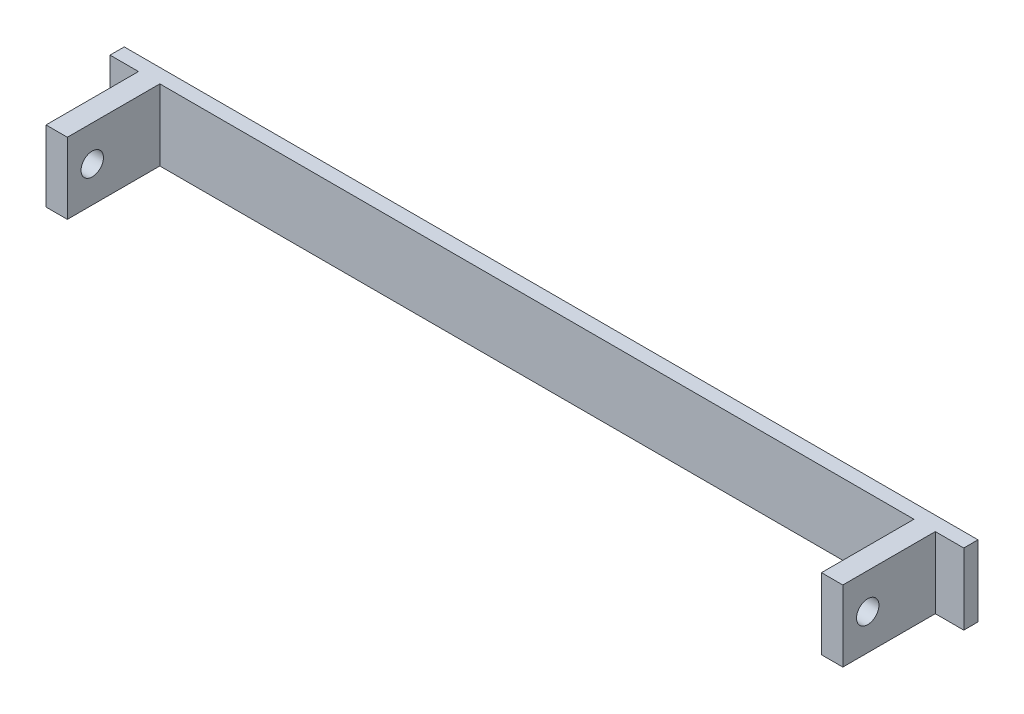
ISO-10303-21;
HEADER;
FILE_DESCRIPTION(('STEP AP214'),'2;1');
FILE_NAME('part.step','',(''),(''),'','','');
FILE_SCHEMA(('AUTOMOTIVE_DESIGN { 1 0 10303 214 1 1 1 1 }'));
ENDSEC;
DATA;
#1=APPLICATION_CONTEXT('core data for automotive mechanical design processes');
#2=APPLICATION_PROTOCOL_DEFINITION('international standard','automotive_design',2000,#1);
#3=PRODUCT_CONTEXT('',#1,'mechanical');
#4=PRODUCT('Part','Part','',(#3));
#5=PRODUCT_RELATED_PRODUCT_CATEGORY('part','',(#4));
#6=PRODUCT_DEFINITION_FORMATION('','',#4);
#7=PRODUCT_DEFINITION_CONTEXT('part definition',#1,'design');
#8=PRODUCT_DEFINITION('design','',#6,#7);
#9=PRODUCT_DEFINITION_SHAPE('','',#8);
#10=(LENGTH_UNIT() NAMED_UNIT(*) SI_UNIT(.MILLI.,.METRE.));
#11=(NAMED_UNIT(*) PLANE_ANGLE_UNIT() SI_UNIT($,.RADIAN.));
#12=(NAMED_UNIT(*) SI_UNIT($,.STERADIAN.) SOLID_ANGLE_UNIT());
#13=UNCERTAINTY_MEASURE_WITH_UNIT(LENGTH_MEASURE(1.E-05),#10,'distance_accuracy_value','');
#14=(GEOMETRIC_REPRESENTATION_CONTEXT(3) GLOBAL_UNCERTAINTY_ASSIGNED_CONTEXT((#13)) GLOBAL_UNIT_ASSIGNED_CONTEXT((#10,
#11,#12)) REPRESENTATION_CONTEXT('',''));
#15=CARTESIAN_POINT('',(0.,0.,0.));
#16=DIRECTION('',(0.,0.,1.));
#17=DIRECTION('',(1.,0.,0.));
#18=AXIS2_PLACEMENT_3D('',#15,#16,#17);
#19=CARTESIAN_POINT('',(0.,0.,2.));
#20=DIRECTION('',(0.,0.,-1.));
#21=DIRECTION('',(-1.,0.,0.));
#22=AXIS2_PLACEMENT_3D('',#19,#20,#21);
#23=PLANE('',#22);
#24=DIRECTION('',(0.,-1.,0.));
#25=VECTOR('',#24,1.);
#26=CARTESIAN_POINT('',(53.,5.,2.));
#27=LINE('',#26,#25);
#28=CARTESIAN_POINT('',(53.,5.,2.));
#29=VERTEX_POINT('',#28);
#30=CARTESIAN_POINT('',(53.,-5.,2.));
#31=VERTEX_POINT('',#30);
#32=EDGE_CURVE('E48',#29,#31,#27,.T.);
#33=ORIENTED_EDGE('',*,*,#32,.F.);
#34=DIRECTION('',(-1.,0.,0.));
#35=VECTOR('',#34,1.);
#36=CARTESIAN_POINT('',(-60.,5.,2.));
#37=LINE('',#36,#35);
#38=CARTESIAN_POINT('',(-53.,5.,2.));
#39=VERTEX_POINT('',#38);
#40=EDGE_CURVE('E185',#29,#39,#37,.T.);
#41=ORIENTED_EDGE('',*,*,#40,.T.);
#42=DIRECTION('',(0.,1.,0.));
#43=VECTOR('',#42,1.);
#44=CARTESIAN_POINT('',(-53.,5.,2.));
#45=LINE('',#44,#43);
#46=CARTESIAN_POINT('',(-53.,-5.,2.));
#47=VERTEX_POINT('',#46);
#48=EDGE_CURVE('E149',#47,#39,#45,.T.);
#49=ORIENTED_EDGE('',*,*,#48,.F.);
#50=DIRECTION('',(1.,0.,0.));
#51=VECTOR('',#50,1.);
#52=CARTESIAN_POINT('',(-60.,-5.,2.));
#53=LINE('',#52,#51);
#54=EDGE_CURVE('E191',#47,#31,#53,.T.);
#55=ORIENTED_EDGE('',*,*,#54,.T.);
#56=EDGE_LOOP('',(#33,#41,#49,#55));
#57=FACE_BOUND('',#56,.T.);
#58=ADVANCED_FACE('F33',(#57),#23,.F.);
#59=DIRECTION('',(0.,1.,0.));
#60=VECTOR('',#59,1.);
#61=CARTESIAN_POINT('',(56.,5.,2.));
#62=LINE('',#61,#60);
#63=CARTESIAN_POINT('',(56.,-5.,2.));
#64=VERTEX_POINT('',#63);
#65=CARTESIAN_POINT('',(56.,5.,2.));
#66=VERTEX_POINT('',#65);
#67=EDGE_CURVE('E143',#64,#66,#62,.T.);
#68=ORIENTED_EDGE('',*,*,#67,.F.);
#69=CARTESIAN_POINT('',(60.,-5.,2.));
#70=VERTEX_POINT('',#69);
#71=EDGE_CURVE('E187',#64,#70,#53,.T.);
#72=ORIENTED_EDGE('',*,*,#71,.T.);
#73=DIRECTION('',(0.,1.,0.));
#74=VECTOR('',#73,1.);
#75=CARTESIAN_POINT('',(60.,-5.,2.));
#76=LINE('',#75,#74);
#77=CARTESIAN_POINT('',(60.,5.,2.));
#78=VERTEX_POINT('',#77);
#79=EDGE_CURVE('E179',#70,#78,#76,.T.);
#80=ORIENTED_EDGE('',*,*,#79,.T.);
#81=EDGE_CURVE('E56',#78,#66,#37,.T.);
#82=ORIENTED_EDGE('',*,*,#81,.T.);
#83=EDGE_LOOP('',(#68,#72,#80,#82));
#84=FACE_BOUND('',#83,.T.);
#85=ADVANCED_FACE('F221',(#84),#23,.F.);
#86=DIRECTION('',(0.,-1.,0.));
#87=VECTOR('',#86,1.);
#88=CARTESIAN_POINT('',(-56.,5.,2.));
#89=LINE('',#88,#87);
#90=CARTESIAN_POINT('',(-56.,5.,2.));
#91=VERTEX_POINT('',#90);
#92=CARTESIAN_POINT('',(-56.,-5.,2.));
#93=VERTEX_POINT('',#92);
#94=EDGE_CURVE('E146',#91,#93,#89,.T.);
#95=ORIENTED_EDGE('',*,*,#94,.F.);
#96=CARTESIAN_POINT('',(-60.,5.,2.));
#97=VERTEX_POINT('',#96);
#98=EDGE_CURVE('E181',#91,#97,#37,.T.);
#99=ORIENTED_EDGE('',*,*,#98,.T.);
#100=DIRECTION('',(0.,-1.,0.));
#101=VECTOR('',#100,1.);
#102=CARTESIAN_POINT('',(-60.,-5.,2.));
#103=LINE('',#102,#101);
#104=CARTESIAN_POINT('',(-60.,-5.,2.));
#105=VERTEX_POINT('',#104);
#106=EDGE_CURVE('E184',#97,#105,#103,.T.);
#107=ORIENTED_EDGE('',*,*,#106,.T.);
#108=EDGE_CURVE('E188',#105,#93,#53,.T.);
#109=ORIENTED_EDGE('',*,*,#108,.T.);
#110=EDGE_LOOP('',(#95,#99,#107,#109));
#111=FACE_BOUND('',#110,.T.);
#112=ADVANCED_FACE('F236',(#111),#23,.F.);
#113=CARTESIAN_POINT('',(60.,-5.,2.));
#114=DIRECTION('',(-1.,0.,0.));
#115=DIRECTION('',(0.,0.,1.));
#116=AXIS2_PLACEMENT_3D('',#113,#114,#115);
#117=PLANE('',#116);
#118=DIRECTION('',(0.,1.,0.));
#119=VECTOR('',#118,1.);
#120=CARTESIAN_POINT('',(60.,-5.,0.));
#121=LINE('',#120,#119);
#122=CARTESIAN_POINT('',(60.,-5.,0.));
#123=VERTEX_POINT('',#122);
#124=CARTESIAN_POINT('',(60.,5.,0.));
#125=VERTEX_POINT('',#124);
#126=EDGE_CURVE('E178',#123,#125,#121,.T.);
#127=ORIENTED_EDGE('',*,*,#126,.T.);
#128=DIRECTION('',(0.,0.,-1.));
#129=VECTOR('',#128,1.);
#130=CARTESIAN_POINT('',(60.,5.,2.));
#131=LINE('',#130,#129);
#132=EDGE_CURVE('E11',#78,#125,#131,.T.);
#133=ORIENTED_EDGE('',*,*,#132,.F.);
#134=ORIENTED_EDGE('',*,*,#79,.F.);
#135=DIRECTION('',(0.,0.,-1.));
#136=VECTOR('',#135,1.);
#137=CARTESIAN_POINT('',(60.,-5.,2.));
#138=LINE('',#137,#136);
#139=EDGE_CURVE('E190',#70,#123,#138,.T.);
#140=ORIENTED_EDGE('',*,*,#139,.T.);
#141=EDGE_LOOP('',(#127,#133,#134,#140));
#142=FACE_BOUND('',#141,.T.);
#143=ADVANCED_FACE('F35',(#142),#117,.F.);
#144=CARTESIAN_POINT('',(-60.,5.,2.));
#145=DIRECTION('',(0.,-1.,0.));
#146=DIRECTION('',(0.,0.,-1.));
#147=AXIS2_PLACEMENT_3D('',#144,#145,#146);
#148=PLANE('',#147);
#149=DIRECTION('',(-1.,0.,0.));
#150=VECTOR('',#149,1.);
#151=CARTESIAN_POINT('',(-60.,5.,0.));
#152=LINE('',#151,#150);
#153=CARTESIAN_POINT('',(-60.,5.,0.));
#154=VERTEX_POINT('',#153);
#155=EDGE_CURVE('E194',#125,#154,#152,.T.);
#156=ORIENTED_EDGE('',*,*,#155,.T.);
#157=DIRECTION('',(0.,0.,-1.));
#158=VECTOR('',#157,1.);
#159=CARTESIAN_POINT('',(-60.,5.,2.));
#160=LINE('',#159,#158);
#161=EDGE_CURVE('E41',#97,#154,#160,.T.);
#162=ORIENTED_EDGE('',*,*,#161,.F.);
#163=ORIENTED_EDGE('',*,*,#98,.F.);
#164=DIRECTION('',(0.,0.,-1.));
#165=VECTOR('',#164,1.);
#166=CARTESIAN_POINT('',(-56.,5.,15.));
#167=LINE('',#166,#165);
#168=CARTESIAN_POINT('',(-56.,5.,15.));
#169=VERTEX_POINT('',#168);
#170=EDGE_CURVE('E163',#169,#91,#167,.T.);
#171=ORIENTED_EDGE('',*,*,#170,.F.);
#172=DIRECTION('',(-1.,0.,0.));
#173=VECTOR('',#172,1.);
#174=CARTESIAN_POINT('',(-56.,5.,15.));
#175=LINE('',#174,#173);
#176=CARTESIAN_POINT('',(-53.,5.,15.));
#177=VERTEX_POINT('',#176);
#178=EDGE_CURVE('E162',#177,#169,#175,.T.);
#179=ORIENTED_EDGE('',*,*,#178,.F.);
#180=DIRECTION('',(0.,0.,-1.));
#181=VECTOR('',#180,1.);
#182=CARTESIAN_POINT('',(-53.,5.,15.));
#183=LINE('',#182,#181);
#184=EDGE_CURVE('E169',#177,#39,#183,.T.);
#185=ORIENTED_EDGE('',*,*,#184,.T.);
#186=ORIENTED_EDGE('',*,*,#40,.F.);
#187=DIRECTION('',(0.,0.,-1.));
#188=VECTOR('',#187,1.);
#189=CARTESIAN_POINT('',(53.,5.,15.));
#190=LINE('',#189,#188);
#191=CARTESIAN_POINT('',(53.,5.,15.));
#192=VERTEX_POINT('',#191);
#193=EDGE_CURVE('E238',#192,#29,#190,.T.);
#194=ORIENTED_EDGE('',*,*,#193,.F.);
#195=DIRECTION('',(-1.,0.,0.));
#196=VECTOR('',#195,1.);
#197=CARTESIAN_POINT('',(53.,5.,15.));
#198=LINE('',#197,#196);
#199=CARTESIAN_POINT('',(56.,5.,15.));
#200=VERTEX_POINT('',#199);
#201=EDGE_CURVE('E139',#200,#192,#198,.T.);
#202=ORIENTED_EDGE('',*,*,#201,.F.);
#203=DIRECTION('',(0.,0.,-1.));
#204=VECTOR('',#203,1.);
#205=CARTESIAN_POINT('',(56.,5.,15.));
#206=LINE('',#205,#204);
#207=EDGE_CURVE('E151',#200,#66,#206,.T.);
#208=ORIENTED_EDGE('',*,*,#207,.T.);
#209=ORIENTED_EDGE('',*,*,#81,.F.);
#210=ORIENTED_EDGE('',*,*,#132,.T.);
#211=EDGE_LOOP('',(#156,#162,#163,#171,#179,#185,#186,#194,#202,#208,#209,#210));
#212=FACE_BOUND('',#211,.T.);
#213=ADVANCED_FACE('F237',(#212),#148,.F.);
#214=CARTESIAN_POINT('',(-60.,-5.,2.));
#215=DIRECTION('',(1.,0.,0.));
#216=DIRECTION('',(0.,0.,-1.));
#217=AXIS2_PLACEMENT_3D('',#214,#215,#216);
#218=PLANE('',#217);
#219=DIRECTION('',(0.,-1.,0.));
#220=VECTOR('',#219,1.);
#221=CARTESIAN_POINT('',(-60.,-5.,0.));
#222=LINE('',#221,#220);
#223=CARTESIAN_POINT('',(-60.,-5.,0.));
#224=VERTEX_POINT('',#223);
#225=EDGE_CURVE('E196',#154,#224,#222,.T.);
#226=ORIENTED_EDGE('',*,*,#225,.T.);
#227=DIRECTION('',(0.,0.,-1.));
#228=VECTOR('',#227,1.);
#229=CARTESIAN_POINT('',(-60.,-5.,2.));
#230=LINE('',#229,#228);
#231=EDGE_CURVE('E201',#105,#224,#230,.T.);
#232=ORIENTED_EDGE('',*,*,#231,.F.);
#233=ORIENTED_EDGE('',*,*,#106,.F.);
#234=ORIENTED_EDGE('',*,*,#161,.T.);
#235=EDGE_LOOP('',(#226,#232,#233,#234));
#236=FACE_BOUND('',#235,.T.);
#237=ADVANCED_FACE('F208',(#236),#218,.F.);
#238=CARTESIAN_POINT('',(-60.,-5.,2.));
#239=DIRECTION('',(0.,1.,0.));
#240=DIRECTION('',(0.,0.,1.));
#241=AXIS2_PLACEMENT_3D('',#238,#239,#240);
#242=PLANE('',#241);
#243=DIRECTION('',(1.,0.,0.));
#244=VECTOR('',#243,1.);
#245=CARTESIAN_POINT('',(-60.,-5.,0.));
#246=LINE('',#245,#244);
#247=EDGE_CURVE('E182',#224,#123,#246,.T.);
#248=ORIENTED_EDGE('',*,*,#247,.T.);
#249=ORIENTED_EDGE('',*,*,#139,.F.);
#250=ORIENTED_EDGE('',*,*,#71,.F.);
#251=DIRECTION('',(0.,0.,-1.));
#252=VECTOR('',#251,1.);
#253=CARTESIAN_POINT('',(56.,-5.,15.));
#254=LINE('',#253,#252);
#255=CARTESIAN_POINT('',(56.,-5.,15.));
#256=VERTEX_POINT('',#255);
#257=EDGE_CURVE('E130',#256,#64,#254,.T.);
#258=ORIENTED_EDGE('',*,*,#257,.F.);
#259=DIRECTION('',(1.,0.,0.));
#260=VECTOR('',#259,1.);
#261=CARTESIAN_POINT('',(53.,-5.,15.));
#262=LINE('',#261,#260);
#263=CARTESIAN_POINT('',(53.,-5.,15.));
#264=VERTEX_POINT('',#263);
#265=EDGE_CURVE('E123',#264,#256,#262,.T.);
#266=ORIENTED_EDGE('',*,*,#265,.F.);
#267=DIRECTION('',(0.,0.,-1.));
#268=VECTOR('',#267,1.);
#269=CARTESIAN_POINT('',(53.,-5.,15.));
#270=LINE('',#269,#268);
#271=EDGE_CURVE('E128',#264,#31,#270,.T.);
#272=ORIENTED_EDGE('',*,*,#271,.T.);
#273=ORIENTED_EDGE('',*,*,#54,.F.);
#274=DIRECTION('',(0.,0.,-1.));
#275=VECTOR('',#274,1.);
#276=CARTESIAN_POINT('',(-53.,-5.,15.));
#277=LINE('',#276,#275);
#278=CARTESIAN_POINT('',(-53.,-5.,15.));
#279=VERTEX_POINT('',#278);
#280=EDGE_CURVE('E172',#279,#47,#277,.T.);
#281=ORIENTED_EDGE('',*,*,#280,.F.);
#282=DIRECTION('',(1.,0.,0.));
#283=VECTOR('',#282,1.);
#284=CARTESIAN_POINT('',(-56.,-5.,15.));
#285=LINE('',#284,#283);
#286=CARTESIAN_POINT('',(-56.,-5.,15.));
#287=VERTEX_POINT('',#286);
#288=EDGE_CURVE('E158',#287,#279,#285,.T.);
#289=ORIENTED_EDGE('',*,*,#288,.F.);
#290=DIRECTION('',(0.,0.,-1.));
#291=VECTOR('',#290,1.);
#292=CARTESIAN_POINT('',(-56.,-5.,15.));
#293=LINE('',#292,#291);
#294=EDGE_CURVE('E175',#287,#93,#293,.T.);
#295=ORIENTED_EDGE('',*,*,#294,.T.);
#296=ORIENTED_EDGE('',*,*,#108,.F.);
#297=ORIENTED_EDGE('',*,*,#231,.T.);
#298=EDGE_LOOP('',(#248,#249,#250,#258,#266,#272,#273,#281,#289,#295,#296,#297));
#299=FACE_BOUND('',#298,.T.);
#300=ADVANCED_FACE('F125',(#299),#242,.F.);
#301=CARTESIAN_POINT('',(0.,0.,0.));
#302=DIRECTION('',(0.,0.,-1.));
#303=DIRECTION('',(-1.,0.,0.));
#304=AXIS2_PLACEMENT_3D('',#301,#302,#303);
#305=PLANE('',#304);
#306=ORIENTED_EDGE('',*,*,#126,.F.);
#307=ORIENTED_EDGE('',*,*,#247,.F.);
#308=ORIENTED_EDGE('',*,*,#225,.F.);
#309=ORIENTED_EDGE('',*,*,#155,.F.);
#310=EDGE_LOOP('',(#306,#307,#308,#309));
#311=FACE_BOUND('',#310,.T.);
#312=ADVANCED_FACE('F215',(#311),#305,.T.);
#313=CARTESIAN_POINT('',(-56.,5.,15.));
#314=DIRECTION('',(1.,0.,0.));
#315=DIRECTION('',(0.,0.,-1.));
#316=AXIS2_PLACEMENT_3D('',#313,#314,#315);
#317=PLANE('',#316);
#318=CARTESIAN_POINT('',(-56.,0.,11.5));
#319=DIRECTION('',(1.,0.,0.));
#320=DIRECTION('',(0.,0.,-1.));
#321=AXIS2_PLACEMENT_3D('',#318,#319,#320);
#322=CIRCLE('',#321,1.575);
#323=CARTESIAN_POINT('',(-56.,1.57500000000006,11.5));
#324=VERTEX_POINT('',#323);
#325=EDGE_CURVE('E252',#324,#324,#322,.F.);
#326=ORIENTED_EDGE('',*,*,#325,.F.);
#327=EDGE_LOOP('',(#326));
#328=FACE_BOUND('',#327,.T.);
#329=ORIENTED_EDGE('',*,*,#94,.T.);
#330=ORIENTED_EDGE('',*,*,#294,.F.);
#331=DIRECTION('',(0.,-1.,0.));
#332=VECTOR('',#331,1.);
#333=CARTESIAN_POINT('',(-56.,5.,15.));
#334=LINE('',#333,#332);
#335=EDGE_CURVE('E155',#169,#287,#334,.T.);
#336=ORIENTED_EDGE('',*,*,#335,.F.);
#337=ORIENTED_EDGE('',*,*,#170,.T.);
#338=EDGE_LOOP('',(#329,#330,#336,#337));
#339=FACE_BOUND('',#338,.T.);
#340=ADVANCED_FACE('F234',(#328,#339),#317,.F.);
#341=CARTESIAN_POINT('',(-53.,5.,15.));
#342=DIRECTION('',(-1.,0.,0.));
#343=DIRECTION('',(0.,0.,1.));
#344=AXIS2_PLACEMENT_3D('',#341,#342,#343);
#345=PLANE('',#344);
#346=CARTESIAN_POINT('',(-53.,0.,11.5));
#347=DIRECTION('',(-1.,0.,0.));
#348=DIRECTION('',(0.,0.,1.));
#349=AXIS2_PLACEMENT_3D('',#346,#347,#348);
#350=CIRCLE('',#349,1.575);
#351=CARTESIAN_POINT('',(-53.,1.57500000000006,11.5));
#352=VERTEX_POINT('',#351);
#353=EDGE_CURVE('E244',#352,#352,#350,.T.);
#354=ORIENTED_EDGE('',*,*,#353,.T.);
#355=EDGE_LOOP('',(#354));
#356=FACE_BOUND('',#355,.T.);
#357=ORIENTED_EDGE('',*,*,#48,.T.);
#358=ORIENTED_EDGE('',*,*,#184,.F.);
#359=DIRECTION('',(0.,1.,0.));
#360=VECTOR('',#359,1.);
#361=CARTESIAN_POINT('',(-53.,5.,15.));
#362=LINE('',#361,#360);
#363=EDGE_CURVE('E160',#279,#177,#362,.T.);
#364=ORIENTED_EDGE('',*,*,#363,.F.);
#365=ORIENTED_EDGE('',*,*,#280,.T.);
#366=EDGE_LOOP('',(#357,#358,#364,#365));
#367=FACE_BOUND('',#366,.T.);
#368=ADVANCED_FACE('F225',(#356,#367),#345,.F.);
#369=CARTESIAN_POINT('',(0.,0.,15.));
#370=DIRECTION('',(0.,0.,1.));
#371=DIRECTION('',(1.,0.,0.));
#372=AXIS2_PLACEMENT_3D('',#369,#370,#371);
#373=PLANE('',#372);
#374=ORIENTED_EDGE('',*,*,#335,.T.);
#375=ORIENTED_EDGE('',*,*,#288,.T.);
#376=ORIENTED_EDGE('',*,*,#363,.T.);
#377=ORIENTED_EDGE('',*,*,#178,.T.);
#378=EDGE_LOOP('',(#374,#375,#376,#377));
#379=FACE_BOUND('',#378,.T.);
#380=ADVANCED_FACE('F229',(#379),#373,.T.);
#381=CARTESIAN_POINT('',(53.,5.,15.));
#382=DIRECTION('',(1.,0.,0.));
#383=DIRECTION('',(0.,0.,-1.));
#384=AXIS2_PLACEMENT_3D('',#381,#382,#383);
#385=PLANE('',#384);
#386=CARTESIAN_POINT('',(53.,0.,11.5));
#387=DIRECTION('',(1.,0.,0.));
#388=DIRECTION('',(0.,0.,-1.));
#389=AXIS2_PLACEMENT_3D('',#386,#387,#388);
#390=CIRCLE('',#389,1.575);
#391=CARTESIAN_POINT('',(53.,0.,9.925));
#392=VERTEX_POINT('',#391);
#393=EDGE_CURVE('E249',#392,#392,#390,.T.);
#394=ORIENTED_EDGE('',*,*,#393,.T.);
#395=EDGE_LOOP('',(#394));
#396=FACE_BOUND('',#395,.T.);
#397=ORIENTED_EDGE('',*,*,#32,.T.);
#398=ORIENTED_EDGE('',*,*,#271,.F.);
#399=DIRECTION('',(0.,-1.,0.));
#400=VECTOR('',#399,1.);
#401=CARTESIAN_POINT('',(53.,5.,15.));
#402=LINE('',#401,#400);
#403=EDGE_CURVE('E134',#192,#264,#402,.T.);
#404=ORIENTED_EDGE('',*,*,#403,.F.);
#405=ORIENTED_EDGE('',*,*,#193,.T.);
#406=EDGE_LOOP('',(#397,#398,#404,#405));
#407=FACE_BOUND('',#406,.T.);
#408=ADVANCED_FACE('F145',(#396,#407),#385,.F.);
#409=CARTESIAN_POINT('',(56.,5.,15.));
#410=DIRECTION('',(-1.,0.,0.));
#411=DIRECTION('',(0.,0.,1.));
#412=AXIS2_PLACEMENT_3D('',#409,#410,#411);
#413=PLANE('',#412);
#414=CARTESIAN_POINT('',(56.,0.,11.5));
#415=DIRECTION('',(1.,0.,0.));
#416=DIRECTION('',(0.,1.,0.));
#417=AXIS2_PLACEMENT_3D('',#414,#415,#416);
#418=CIRCLE('',#417,1.575);
#419=CARTESIAN_POINT('',(56.,1.575,11.5));
#420=VERTEX_POINT('',#419);
#421=EDGE_CURVE('E255',#420,#420,#418,.T.);
#422=ORIENTED_EDGE('',*,*,#421,.F.);
#423=EDGE_LOOP('',(#422));
#424=FACE_BOUND('',#423,.T.);
#425=ORIENTED_EDGE('',*,*,#67,.T.);
#426=ORIENTED_EDGE('',*,*,#207,.F.);
#427=DIRECTION('',(0.,1.,0.));
#428=VECTOR('',#427,1.);
#429=CARTESIAN_POINT('',(56.,5.,15.));
#430=LINE('',#429,#428);
#431=EDGE_CURVE('E133',#256,#200,#430,.T.);
#432=ORIENTED_EDGE('',*,*,#431,.F.);
#433=ORIENTED_EDGE('',*,*,#257,.T.);
#434=EDGE_LOOP('',(#425,#426,#432,#433));
#435=FACE_BOUND('',#434,.T.);
#436=ADVANCED_FACE('F262',(#424,#435),#413,.F.);
#437=CARTESIAN_POINT('',(0.,0.,15.));
#438=DIRECTION('',(0.,0.,1.));
#439=DIRECTION('',(1.,0.,0.));
#440=AXIS2_PLACEMENT_3D('',#437,#438,#439);
#441=PLANE('',#440);
#442=ORIENTED_EDGE('',*,*,#403,.T.);
#443=ORIENTED_EDGE('',*,*,#265,.T.);
#444=ORIENTED_EDGE('',*,*,#431,.T.);
#445=ORIENTED_EDGE('',*,*,#201,.T.);
#446=EDGE_LOOP('',(#442,#443,#444,#445));
#447=FACE_BOUND('',#446,.T.);
#448=ADVANCED_FACE('F137',(#447),#441,.T.);
#449=CARTESIAN_POINT('',(-60.4547727214752,0.,11.5));
#450=DIRECTION('',(1.,0.,0.));
#451=DIRECTION('',(0.,1.,0.));
#452=AXIS2_PLACEMENT_3D('',#449,#450,#451);
#453=CYLINDRICAL_SURFACE('',#452,1.575);
#454=ORIENTED_EDGE('',*,*,#421,.T.);
#455=EDGE_LOOP('',(#454));
#456=FACE_BOUND('',#455,.T.);
#457=ORIENTED_EDGE('',*,*,#393,.F.);
#458=EDGE_LOOP('',(#457));
#459=FACE_BOUND('',#458,.T.);
#460=ADVANCED_FACE('F259',(#456,#459),#453,.F.);
#461=CARTESIAN_POINT('',(-56.,1.57500000000006,11.5));
#462=CARTESIAN_POINT('',(-55.96875,1.57500000000006,11.5));
#463=CARTESIAN_POINT('',(-55.9375,1.57500000000006,11.5));
#464=CARTESIAN_POINT('',(-55.875,1.57500000000006,11.5));
#465=CARTESIAN_POINT('',(-55.84375,1.57500000000006,11.5));
#466=CARTESIAN_POINT('',(-55.78125,1.57500000000006,11.5));
#467=CARTESIAN_POINT('',(-55.75,1.57500000000006,11.5));
#468=CARTESIAN_POINT('',(-55.6875,1.57500000000006,11.5));
#469=CARTESIAN_POINT('',(-55.65625,1.57500000000006,11.5));
#470=CARTESIAN_POINT('',(-55.59375,1.57500000000006,11.5));
#471=CARTESIAN_POINT('',(-55.5625,1.57500000000006,11.5));
#472=CARTESIAN_POINT('',(-55.5,1.57500000000006,11.5));
#473=CARTESIAN_POINT('',(-55.46875,1.57500000000006,11.5));
#474=CARTESIAN_POINT('',(-55.40625,1.57500000000006,11.5));
#475=CARTESIAN_POINT('',(-55.375,1.57500000000006,11.5));
#476=CARTESIAN_POINT('',(-55.3125,1.57500000000006,11.5));
#477=CARTESIAN_POINT('',(-55.28125,1.57500000000006,11.5));
#478=CARTESIAN_POINT('',(-55.21875,1.57500000000006,11.5));
#479=CARTESIAN_POINT('',(-55.1875,1.57500000000006,11.5));
#480=CARTESIAN_POINT('',(-55.125,1.57500000000006,11.5));
#481=CARTESIAN_POINT('',(-55.09375,1.57500000000006,11.5));
#482=CARTESIAN_POINT('',(-55.03125,1.57500000000006,11.5));
#483=CARTESIAN_POINT('',(-55.,1.57500000000006,11.5));
#484=CARTESIAN_POINT('',(-54.9375,1.57500000000006,11.5));
#485=CARTESIAN_POINT('',(-54.90625,1.57500000000006,11.5));
#486=CARTESIAN_POINT('',(-54.84375,1.57500000000006,11.5));
#487=CARTESIAN_POINT('',(-54.8125,1.57500000000006,11.5));
#488=CARTESIAN_POINT('',(-54.75,1.57500000000006,11.5));
#489=CARTESIAN_POINT('',(-54.71875,1.57500000000006,11.5));
#490=CARTESIAN_POINT('',(-54.65625,1.57500000000006,11.5));
#491=CARTESIAN_POINT('',(-54.625,1.57500000000006,11.5));
#492=CARTESIAN_POINT('',(-54.5625,1.57500000000006,11.5));
#493=CARTESIAN_POINT('',(-54.53125,1.57500000000006,11.5));
#494=CARTESIAN_POINT('',(-54.46875,1.57500000000006,11.5));
#495=CARTESIAN_POINT('',(-54.4375,1.57500000000006,11.5));
#496=CARTESIAN_POINT('',(-54.375,1.57500000000006,11.5));
#497=CARTESIAN_POINT('',(-54.34375,1.57500000000006,11.5));
#498=CARTESIAN_POINT('',(-54.28125,1.57500000000006,11.5));
#499=CARTESIAN_POINT('',(-54.25,1.57500000000006,11.5));
#500=CARTESIAN_POINT('',(-54.1875,1.57500000000006,11.5));
#501=CARTESIAN_POINT('',(-54.15625,1.57500000000006,11.5));
#502=CARTESIAN_POINT('',(-54.09375,1.57500000000006,11.5));
#503=CARTESIAN_POINT('',(-54.0625,1.57500000000006,11.5));
#504=CARTESIAN_POINT('',(-54.,1.57500000000006,11.5));
#505=CARTESIAN_POINT('',(-53.96875,1.57500000000006,11.5));
#506=CARTESIAN_POINT('',(-53.90625,1.57500000000006,11.5));
#507=CARTESIAN_POINT('',(-53.875,1.57500000000006,11.5));
#508=CARTESIAN_POINT('',(-53.8125,1.57500000000006,11.5));
#509=CARTESIAN_POINT('',(-53.78125,1.57500000000006,11.5));
#510=CARTESIAN_POINT('',(-53.71875,1.57500000000006,11.5));
#511=CARTESIAN_POINT('',(-53.6875,1.57500000000006,11.5));
#512=CARTESIAN_POINT('',(-53.625,1.57500000000006,11.5));
#513=CARTESIAN_POINT('',(-53.59375,1.57500000000006,11.5));
#514=CARTESIAN_POINT('',(-53.53125,1.57500000000006,11.5));
#515=CARTESIAN_POINT('',(-53.5,1.57500000000006,11.5));
#516=CARTESIAN_POINT('',(-53.4375,1.57500000000006,11.5));
#517=CARTESIAN_POINT('',(-53.40625,1.57500000000006,11.5));
#518=CARTESIAN_POINT('',(-53.34375,1.57500000000006,11.5));
#519=CARTESIAN_POINT('',(-53.3125,1.57500000000006,11.5));
#520=CARTESIAN_POINT('',(-53.25,1.57500000000006,11.5));
#521=CARTESIAN_POINT('',(-53.21875,1.57500000000006,11.5));
#522=CARTESIAN_POINT('',(-53.15625,1.57500000000006,11.5));
#523=CARTESIAN_POINT('',(-53.125,1.57500000000006,11.5));
#524=CARTESIAN_POINT('',(-53.0625,1.57500000000006,11.5));
#525=CARTESIAN_POINT('',(-53.03125,1.57500000000006,11.5));
#526=CARTESIAN_POINT('',(-53.,1.57500000000006,11.5));
#527=B_SPLINE_CURVE_WITH_KNOTS('',3,(#461,#462,#463,#464,#465,#466,#467,#468,#469,#470,#471,
#472,#473,#474,#475,#476,#477,#478,#479,#480,#481,#482,#483,#484,#485,#486,#487,#488,#489,#490,
#491,#492,#493,#494,#495,#496,#497,#498,#499,#500,#501,#502,#503,#504,#505,#506,#507,#508,#509,
#510,#511,#512,#513,#514,#515,#516,#517,#518,#519,#520,#521,#522,#523,#524,#525,#526),
.UNSPECIFIED.,.F.,.F.,(4,2,2,2,2,2,2,2,2,2,2,2,2,2,2,2,2,2,2,2,2,2,2,2,2,2,2,2,2,2,2,2,4),(0.,
0.0937499999999966,0.187499999999993,0.281249999999997,0.375,0.468749999999997,0.5625,
0.656249999999997,0.750000000000001,0.843749999999997,0.937500000000001,1.03125,1.125,1.21875,
1.3125,1.40625,1.5,1.59375,1.6875,1.78125000000001,1.875,1.96875000000001,2.0625,
2.15625000000001,2.25,2.34375000000001,2.4375,2.53125000000001,2.625,2.71875000000001,
2.81250000000001,2.90625000000001,3.),.UNSPECIFIED.);
#528=EDGE_CURVE('BSEAM333',#324,#352,#527,.T.);
#529=ORIENTED_EDGE('',*,*,#325,.T.);
#530=ORIENTED_EDGE('',*,*,#353,.F.);
#531=ORIENTED_EDGE('',*,*,#528,.T.);
#532=ORIENTED_EDGE('',*,*,#528,.F.);
#533=EDGE_LOOP('',(#529,#531,#530,#532));
#534=FACE_BOUND('',#533,.T.);
#535=ADVANCED_FACE('F333',(#534),#453,.F.);
#536=CLOSED_SHELL('',(#58,#85,#112,#143,#213,#237,#300,#312,#340,#368,#380,#408,#436,#448,#460,#535));
#537=MANIFOLD_SOLID_BREP('B2',#536);
#538=ADVANCED_BREP_SHAPE_REPRESENTATION('',(#18,#537),#14);
#539=SHAPE_DEFINITION_REPRESENTATION(#9,#538);
ENDSEC;
END-ISO-10303-21;
